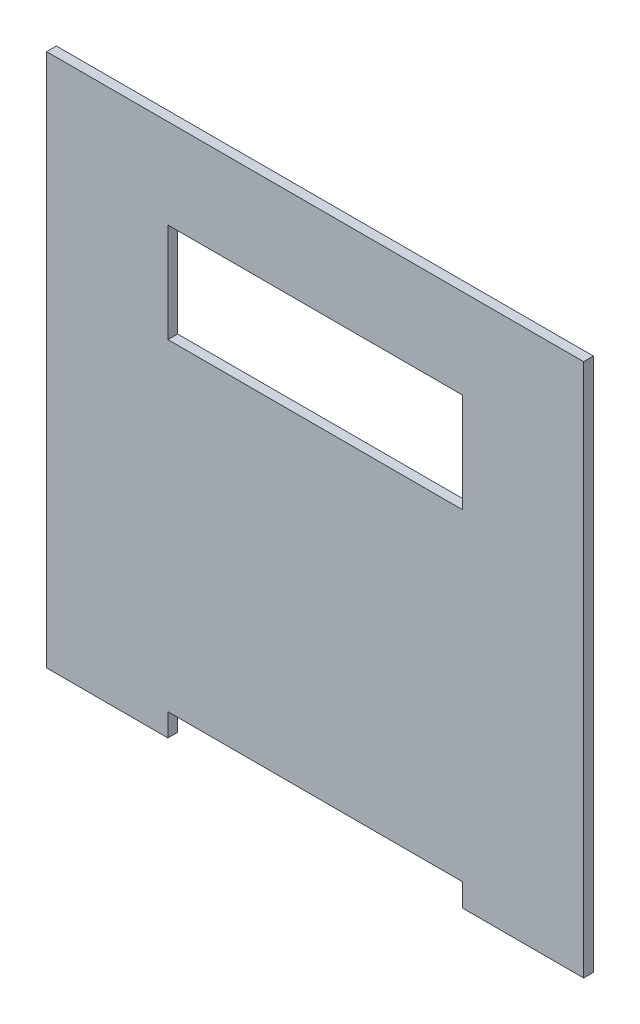
ISO-10303-21;
HEADER;
FILE_DESCRIPTION(('STEP AP214'),'2;1');
FILE_NAME('part.step','',(''),(''),'','','');
FILE_SCHEMA(('AUTOMOTIVE_DESIGN { 1 0 10303 214 1 1 1 1 }'));
ENDSEC;
DATA;
#1=APPLICATION_CONTEXT('core data for automotive mechanical design processes');
#2=APPLICATION_PROTOCOL_DEFINITION('international standard','automotive_design',2000,#1);
#3=PRODUCT_CONTEXT('',#1,'mechanical');
#4=PRODUCT('Part','Part','',(#3));
#5=PRODUCT_RELATED_PRODUCT_CATEGORY('part','',(#4));
#6=PRODUCT_DEFINITION_FORMATION('','',#4);
#7=PRODUCT_DEFINITION_CONTEXT('part definition',#1,'design');
#8=PRODUCT_DEFINITION('design','',#6,#7);
#9=PRODUCT_DEFINITION_SHAPE('','',#8);
#10=(LENGTH_UNIT() NAMED_UNIT(*) SI_UNIT(.MILLI.,.METRE.));
#11=(NAMED_UNIT(*) PLANE_ANGLE_UNIT() SI_UNIT($,.RADIAN.));
#12=(NAMED_UNIT(*) SI_UNIT($,.STERADIAN.) SOLID_ANGLE_UNIT());
#13=UNCERTAINTY_MEASURE_WITH_UNIT(LENGTH_MEASURE(1.E-05),#10,'distance_accuracy_value','');
#14=(GEOMETRIC_REPRESENTATION_CONTEXT(3) GLOBAL_UNCERTAINTY_ASSIGNED_CONTEXT((#13)) GLOBAL_UNIT_ASSIGNED_CONTEXT((#10,
#11,#12)) REPRESENTATION_CONTEXT('',''));
#15=CARTESIAN_POINT('',(0.,0.,0.));
#16=DIRECTION('',(0.,0.,1.));
#17=DIRECTION('',(1.,0.,0.));
#18=AXIS2_PLACEMENT_3D('',#15,#16,#17);
#19=CARTESIAN_POINT('',(0.,0.,6.));
#20=DIRECTION('',(0.,1.,0.));
#21=DIRECTION('',(-1.,0.,0.));
#22=AXIS2_PLACEMENT_3D('',#19,#20,#21);
#23=PLANE('',#22);
#24=DIRECTION('',(1.,0.,0.));
#25=VECTOR('',#24,1.);
#26=CARTESIAN_POINT('',(0.,0.,6.));
#27=LINE('',#26,#25);
#28=CARTESIAN_POINT('',(-74.5,0.,6.));
#29=VERTEX_POINT('',#28);
#30=CARTESIAN_POINT('',(0.,0.,6.));
#31=VERTEX_POINT('',#30);
#32=EDGE_CURVE('E139',#29,#31,#27,.T.);
#33=ORIENTED_EDGE('',*,*,#32,.F.);
#34=DIRECTION('',(0.,0.,-1.));
#35=VECTOR('',#34,1.);
#36=CARTESIAN_POINT('',(-74.5,0.,6.));
#37=LINE('',#36,#35);
#38=CARTESIAN_POINT('',(-74.5,0.,0.));
#39=VERTEX_POINT('',#38);
#40=EDGE_CURVE('E123',#29,#39,#37,.T.);
#41=ORIENTED_EDGE('',*,*,#40,.T.);
#42=DIRECTION('',(1.,0.,0.));
#43=VECTOR('',#42,1.);
#44=CARTESIAN_POINT('',(0.,0.,0.));
#45=LINE('',#44,#43);
#46=CARTESIAN_POINT('',(0.,0.,0.));
#47=VERTEX_POINT('',#46);
#48=EDGE_CURVE('E165',#39,#47,#45,.T.);
#49=ORIENTED_EDGE('',*,*,#48,.T.);
#50=DIRECTION('',(0.,0.,-1.));
#51=VECTOR('',#50,1.);
#52=CARTESIAN_POINT('',(0.,0.,6.));
#53=LINE('',#52,#51);
#54=EDGE_CURVE('E147',#31,#47,#53,.T.);
#55=ORIENTED_EDGE('',*,*,#54,.F.);
#56=EDGE_LOOP('',(#33,#41,#49,#55));
#57=FACE_BOUND('',#56,.T.);
#58=ADVANCED_FACE('F33',(#57),#23,.F.);
#59=CARTESIAN_POINT('',(0.,0.,6.));
#60=DIRECTION('',(-1.,0.,0.));
#61=DIRECTION('',(0.,-1.,0.));
#62=AXIS2_PLACEMENT_3D('',#59,#60,#61);
#63=PLANE('',#62);
#64=DIRECTION('',(0.,1.,0.));
#65=VECTOR('',#64,1.);
#66=CARTESIAN_POINT('',(0.,0.,0.));
#67=LINE('',#66,#65);
#68=CARTESIAN_POINT('',(0.,328.,0.));
#69=VERTEX_POINT('',#68);
#70=EDGE_CURVE('E157',#47,#69,#67,.T.);
#71=ORIENTED_EDGE('',*,*,#70,.T.);
#72=DIRECTION('',(0.,0.,-1.));
#73=VECTOR('',#72,1.);
#74=CARTESIAN_POINT('',(0.,328.,6.));
#75=LINE('',#74,#73);
#76=CARTESIAN_POINT('',(0.,328.,6.));
#77=VERTEX_POINT('',#76);
#78=EDGE_CURVE('E11',#77,#69,#75,.T.);
#79=ORIENTED_EDGE('',*,*,#78,.F.);
#80=DIRECTION('',(0.,1.,0.));
#81=VECTOR('',#80,1.);
#82=CARTESIAN_POINT('',(0.,0.,6.));
#83=LINE('',#82,#81);
#84=EDGE_CURVE('E169',#31,#77,#83,.T.);
#85=ORIENTED_EDGE('',*,*,#84,.F.);
#86=ORIENTED_EDGE('',*,*,#54,.T.);
#87=EDGE_LOOP('',(#71,#79,#85,#86));
#88=FACE_BOUND('',#87,.T.);
#89=ADVANCED_FACE('F35',(#88),#63,.F.);
#90=CARTESIAN_POINT('',(0.,328.,6.));
#91=DIRECTION('',(0.,-1.,0.));
#92=DIRECTION('',(1.,0.,0.));
#93=AXIS2_PLACEMENT_3D('',#90,#91,#92);
#94=PLANE('',#93);
#95=DIRECTION('',(-1.,0.,0.));
#96=VECTOR('',#95,1.);
#97=CARTESIAN_POINT('',(0.,328.,0.));
#98=LINE('',#97,#96);
#99=CARTESIAN_POINT('',(-330.,328.,0.));
#100=VERTEX_POINT('',#99);
#101=EDGE_CURVE('E160',#69,#100,#98,.T.);
#102=ORIENTED_EDGE('',*,*,#101,.T.);
#103=DIRECTION('',(0.,0.,-1.));
#104=VECTOR('',#103,1.);
#105=CARTESIAN_POINT('',(-330.,328.,6.));
#106=LINE('',#105,#104);
#107=CARTESIAN_POINT('',(-330.,328.,6.));
#108=VERTEX_POINT('',#107);
#109=EDGE_CURVE('E41',#108,#100,#106,.T.);
#110=ORIENTED_EDGE('',*,*,#109,.F.);
#111=DIRECTION('',(-1.,0.,0.));
#112=VECTOR('',#111,1.);
#113=CARTESIAN_POINT('',(0.,328.,6.));
#114=LINE('',#113,#112);
#115=EDGE_CURVE('E153',#77,#108,#114,.T.);
#116=ORIENTED_EDGE('',*,*,#115,.F.);
#117=ORIENTED_EDGE('',*,*,#78,.T.);
#118=EDGE_LOOP('',(#102,#110,#116,#117));
#119=FACE_BOUND('',#118,.T.);
#120=ADVANCED_FACE('F249',(#119),#94,.F.);
#121=CARTESIAN_POINT('',(-330.,0.,6.));
#122=DIRECTION('',(1.,0.,0.));
#123=DIRECTION('',(0.,0.,-1.));
#124=AXIS2_PLACEMENT_3D('',#121,#122,#123);
#125=PLANE('',#124);
#126=DIRECTION('',(0.,-1.,0.));
#127=VECTOR('',#126,1.);
#128=CARTESIAN_POINT('',(-330.,0.,0.));
#129=LINE('',#128,#127);
#130=CARTESIAN_POINT('',(-330.,0.,0.));
#131=VERTEX_POINT('',#130);
#132=EDGE_CURVE('E163',#100,#131,#129,.T.);
#133=ORIENTED_EDGE('',*,*,#132,.T.);
#134=DIRECTION('',(0.,0.,-1.));
#135=VECTOR('',#134,1.);
#136=CARTESIAN_POINT('',(-330.,0.,6.));
#137=LINE('',#136,#135);
#138=CARTESIAN_POINT('',(-330.,0.,6.));
#139=VERTEX_POINT('',#138);
#140=EDGE_CURVE('E171',#139,#131,#137,.T.);
#141=ORIENTED_EDGE('',*,*,#140,.F.);
#142=DIRECTION('',(0.,-1.,0.));
#143=VECTOR('',#142,1.);
#144=CARTESIAN_POINT('',(-330.,0.,6.));
#145=LINE('',#144,#143);
#146=EDGE_CURVE('E150',#108,#139,#145,.T.);
#147=ORIENTED_EDGE('',*,*,#146,.F.);
#148=ORIENTED_EDGE('',*,*,#109,.T.);
#149=EDGE_LOOP('',(#133,#141,#147,#148));
#150=FACE_BOUND('',#149,.T.);
#151=ADVANCED_FACE('F178',(#150),#125,.F.);
#152=CARTESIAN_POINT('',(-255.5,0.,0.));
#153=VERTEX_POINT('',#152);
#154=EDGE_CURVE('E166',#131,#153,#45,.T.);
#155=ORIENTED_EDGE('',*,*,#154,.T.);
#156=DIRECTION('',(0.,0.,-1.));
#157=VECTOR('',#156,1.);
#158=CARTESIAN_POINT('',(-255.5,0.,6.));
#159=LINE('',#158,#157);
#160=CARTESIAN_POINT('',(-255.5,0.,6.));
#161=VERTEX_POINT('',#160);
#162=EDGE_CURVE('E48',#161,#153,#159,.T.);
#163=ORIENTED_EDGE('',*,*,#162,.F.);
#164=EDGE_CURVE('E149',#139,#161,#27,.T.);
#165=ORIENTED_EDGE('',*,*,#164,.F.);
#166=ORIENTED_EDGE('',*,*,#140,.T.);
#167=EDGE_LOOP('',(#155,#163,#165,#166));
#168=FACE_BOUND('',#167,.T.);
#169=ADVANCED_FACE('F188',(#168),#23,.F.);
#170=CARTESIAN_POINT('',(0.,0.,6.));
#171=DIRECTION('',(0.,0.,1.));
#172=DIRECTION('',(1.,0.,0.));
#173=AXIS2_PLACEMENT_3D('',#170,#171,#172);
#174=PLANE('',#173);
#175=DIRECTION('',(0.,-1.,0.));
#176=VECTOR('',#175,1.);
#177=CARTESIAN_POINT('',(-74.5,0.,6.));
#178=LINE('',#177,#176);
#179=CARTESIAN_POINT('',(-74.5,14.,6.));
#180=VERTEX_POINT('',#179);
#181=EDGE_CURVE('E126',#180,#29,#178,.T.);
#182=ORIENTED_EDGE('',*,*,#181,.T.);
#183=ORIENTED_EDGE('',*,*,#32,.T.);
#184=ORIENTED_EDGE('',*,*,#84,.T.);
#185=ORIENTED_EDGE('',*,*,#115,.T.);
#186=ORIENTED_EDGE('',*,*,#146,.T.);
#187=ORIENTED_EDGE('',*,*,#164,.T.);
#188=DIRECTION('',(0.,1.,0.));
#189=VECTOR('',#188,1.);
#190=CARTESIAN_POINT('',(-255.5,0.,6.));
#191=LINE('',#190,#189);
#192=CARTESIAN_POINT('',(-255.5,14.,6.));
#193=VERTEX_POINT('',#192);
#194=EDGE_CURVE('E143',#161,#193,#191,.T.);
#195=ORIENTED_EDGE('',*,*,#194,.T.);
#196=DIRECTION('',(1.,0.,0.));
#197=VECTOR('',#196,1.);
#198=CARTESIAN_POINT('',(-74.5,14.,6.));
#199=LINE('',#198,#197);
#200=EDGE_CURVE('E133',#193,#180,#199,.T.);
#201=ORIENTED_EDGE('',*,*,#200,.T.);
#202=EDGE_LOOP('',(#182,#183,#184,#185,#186,#187,#195,#201));
#203=FACE_BOUND('',#202,.T.);
#204=DIRECTION('',(0.,-1.,0.));
#205=VECTOR('',#204,1.);
#206=CARTESIAN_POINT('',(-74.5,273.,6.));
#207=LINE('',#206,#205);
#208=CARTESIAN_POINT('',(-74.5,273.,6.));
#209=VERTEX_POINT('',#208);
#210=CARTESIAN_POINT('',(-74.5,212.,6.));
#211=VERTEX_POINT('',#210);
#212=EDGE_CURVE('E205',#209,#211,#207,.T.);
#213=ORIENTED_EDGE('',*,*,#212,.T.);
#214=DIRECTION('',(-1.,0.,0.));
#215=VECTOR('',#214,1.);
#216=CARTESIAN_POINT('',(-74.5,212.,6.));
#217=LINE('',#216,#215);
#218=CARTESIAN_POINT('',(-255.5,212.,6.));
#219=VERTEX_POINT('',#218);
#220=EDGE_CURVE('E218',#211,#219,#217,.T.);
#221=ORIENTED_EDGE('',*,*,#220,.T.);
#222=DIRECTION('',(0.,1.,0.));
#223=VECTOR('',#222,1.);
#224=CARTESIAN_POINT('',(-255.5,273.,6.));
#225=LINE('',#224,#223);
#226=CARTESIAN_POINT('',(-255.5,273.,6.));
#227=VERTEX_POINT('',#226);
#228=EDGE_CURVE('E56',#219,#227,#225,.T.);
#229=ORIENTED_EDGE('',*,*,#228,.T.);
#230=DIRECTION('',(1.,0.,0.));
#231=VECTOR('',#230,1.);
#232=CARTESIAN_POINT('',(-74.5,273.,6.));
#233=LINE('',#232,#231);
#234=EDGE_CURVE('E197',#227,#209,#233,.T.);
#235=ORIENTED_EDGE('',*,*,#234,.T.);
#236=EDGE_LOOP('',(#213,#221,#229,#235));
#237=FACE_BOUND('',#236,.T.);
#238=ADVANCED_FACE('F136',(#203,#237),#174,.T.);
#239=CARTESIAN_POINT('',(0.,0.,0.));
#240=DIRECTION('',(0.,0.,1.));
#241=DIRECTION('',(1.,0.,0.));
#242=AXIS2_PLACEMENT_3D('',#239,#240,#241);
#243=PLANE('',#242);
#244=DIRECTION('',(-1.,0.,0.));
#245=VECTOR('',#244,1.);
#246=CARTESIAN_POINT('',(-74.5,212.,0.));
#247=LINE('',#246,#245);
#248=CARTESIAN_POINT('',(-74.5,212.,0.));
#249=VERTEX_POINT('',#248);
#250=CARTESIAN_POINT('',(-255.5,212.,0.));
#251=VERTEX_POINT('',#250);
#252=EDGE_CURVE('E209',#249,#251,#247,.T.);
#253=ORIENTED_EDGE('',*,*,#252,.F.);
#254=DIRECTION('',(0.,-1.,0.));
#255=VECTOR('',#254,1.);
#256=CARTESIAN_POINT('',(-74.5,273.,0.));
#257=LINE('',#256,#255);
#258=CARTESIAN_POINT('',(-74.5,273.,0.));
#259=VERTEX_POINT('',#258);
#260=EDGE_CURVE('E212',#259,#249,#257,.T.);
#261=ORIENTED_EDGE('',*,*,#260,.F.);
#262=DIRECTION('',(1.,0.,0.));
#263=VECTOR('',#262,1.);
#264=CARTESIAN_POINT('',(-74.5,273.,0.));
#265=LINE('',#264,#263);
#266=CARTESIAN_POINT('',(-255.5,273.,0.));
#267=VERTEX_POINT('',#266);
#268=EDGE_CURVE('E202',#267,#259,#265,.T.);
#269=ORIENTED_EDGE('',*,*,#268,.F.);
#270=DIRECTION('',(0.,1.,0.));
#271=VECTOR('',#270,1.);
#272=CARTESIAN_POINT('',(-255.5,273.,0.));
#273=LINE('',#272,#271);
#274=EDGE_CURVE('E206',#251,#267,#273,.T.);
#275=ORIENTED_EDGE('',*,*,#274,.F.);
#276=EDGE_LOOP('',(#253,#261,#269,#275));
#277=FACE_BOUND('',#276,.T.);
#278=ORIENTED_EDGE('',*,*,#48,.F.);
#279=DIRECTION('',(0.,-1.,0.));
#280=VECTOR('',#279,1.);
#281=CARTESIAN_POINT('',(-74.5,0.,0.));
#282=LINE('',#281,#280);
#283=CARTESIAN_POINT('',(-74.5,14.,0.));
#284=VERTEX_POINT('',#283);
#285=EDGE_CURVE('E129',#284,#39,#282,.T.);
#286=ORIENTED_EDGE('',*,*,#285,.F.);
#287=DIRECTION('',(1.,0.,0.));
#288=VECTOR('',#287,1.);
#289=CARTESIAN_POINT('',(-74.5,14.,0.));
#290=LINE('',#289,#288);
#291=CARTESIAN_POINT('',(-255.5,14.,0.));
#292=VERTEX_POINT('',#291);
#293=EDGE_CURVE('E144',#292,#284,#290,.T.);
#294=ORIENTED_EDGE('',*,*,#293,.F.);
#295=DIRECTION('',(0.,1.,0.));
#296=VECTOR('',#295,1.);
#297=CARTESIAN_POINT('',(-255.5,0.,0.));
#298=LINE('',#297,#296);
#299=EDGE_CURVE('E186',#153,#292,#298,.T.);
#300=ORIENTED_EDGE('',*,*,#299,.F.);
#301=ORIENTED_EDGE('',*,*,#154,.F.);
#302=ORIENTED_EDGE('',*,*,#132,.F.);
#303=ORIENTED_EDGE('',*,*,#101,.F.);
#304=ORIENTED_EDGE('',*,*,#70,.F.);
#305=EDGE_LOOP('',(#278,#286,#294,#300,#301,#302,#303,#304));
#306=FACE_BOUND('',#305,.T.);
#307=ADVANCED_FACE('F183',(#277,#306),#243,.F.);
#308=CARTESIAN_POINT('',(-74.5,273.,6.));
#309=DIRECTION('',(1.,0.,0.));
#310=DIRECTION('',(0.,0.,-1.));
#311=AXIS2_PLACEMENT_3D('',#308,#309,#310);
#312=PLANE('',#311);
#313=ORIENTED_EDGE('',*,*,#260,.T.);
#314=DIRECTION('',(0.,0.,-1.));
#315=VECTOR('',#314,1.);
#316=CARTESIAN_POINT('',(-74.5,212.,6.));
#317=LINE('',#316,#315);
#318=EDGE_CURVE('E193',#211,#249,#317,.T.);
#319=ORIENTED_EDGE('',*,*,#318,.F.);
#320=ORIENTED_EDGE('',*,*,#212,.F.);
#321=DIRECTION('',(0.,0.,-1.));
#322=VECTOR('',#321,1.);
#323=CARTESIAN_POINT('',(-74.5,273.,6.));
#324=LINE('',#323,#322);
#325=EDGE_CURVE('E161',#209,#259,#324,.T.);
#326=ORIENTED_EDGE('',*,*,#325,.T.);
#327=EDGE_LOOP('',(#313,#319,#320,#326));
#328=FACE_BOUND('',#327,.T.);
#329=ADVANCED_FACE('F293',(#328),#312,.F.);
#330=CARTESIAN_POINT('',(-74.5,273.,6.));
#331=DIRECTION('',(0.,1.,0.));
#332=DIRECTION('',(0.,0.,1.));
#333=AXIS2_PLACEMENT_3D('',#330,#331,#332);
#334=PLANE('',#333);
#335=ORIENTED_EDGE('',*,*,#268,.T.);
#336=ORIENTED_EDGE('',*,*,#325,.F.);
#337=ORIENTED_EDGE('',*,*,#234,.F.);
#338=DIRECTION('',(0.,0.,-1.));
#339=VECTOR('',#338,1.);
#340=CARTESIAN_POINT('',(-255.5,273.,6.));
#341=LINE('',#340,#339);
#342=EDGE_CURVE('E199',#227,#267,#341,.T.);
#343=ORIENTED_EDGE('',*,*,#342,.T.);
#344=EDGE_LOOP('',(#335,#336,#337,#343));
#345=FACE_BOUND('',#344,.T.);
#346=ADVANCED_FACE('F305',(#345),#334,.F.);
#347=CARTESIAN_POINT('',(-255.5,273.,6.));
#348=DIRECTION('',(-1.,0.,0.));
#349=DIRECTION('',(0.,0.,1.));
#350=AXIS2_PLACEMENT_3D('',#347,#348,#349);
#351=PLANE('',#350);
#352=ORIENTED_EDGE('',*,*,#274,.T.);
#353=ORIENTED_EDGE('',*,*,#342,.F.);
#354=ORIENTED_EDGE('',*,*,#228,.F.);
#355=DIRECTION('',(0.,0.,-1.));
#356=VECTOR('',#355,1.);
#357=CARTESIAN_POINT('',(-255.5,212.,6.));
#358=LINE('',#357,#356);
#359=EDGE_CURVE('E196',#219,#251,#358,.T.);
#360=ORIENTED_EDGE('',*,*,#359,.T.);
#361=EDGE_LOOP('',(#352,#353,#354,#360));
#362=FACE_BOUND('',#361,.T.);
#363=ADVANCED_FACE('F314',(#362),#351,.F.);
#364=CARTESIAN_POINT('',(-74.5,212.,6.));
#365=DIRECTION('',(0.,-1.,0.));
#366=DIRECTION('',(0.,0.,-1.));
#367=AXIS2_PLACEMENT_3D('',#364,#365,#366);
#368=PLANE('',#367);
#369=ORIENTED_EDGE('',*,*,#252,.T.);
#370=ORIENTED_EDGE('',*,*,#359,.F.);
#371=ORIENTED_EDGE('',*,*,#220,.F.);
#372=ORIENTED_EDGE('',*,*,#318,.T.);
#373=EDGE_LOOP('',(#369,#370,#371,#372));
#374=FACE_BOUND('',#373,.T.);
#375=ADVANCED_FACE('F242',(#374),#368,.F.);
#376=CARTESIAN_POINT('',(-74.5,0.,6.));
#377=DIRECTION('',(1.,0.,0.));
#378=DIRECTION('',(0.,0.,-1.));
#379=AXIS2_PLACEMENT_3D('',#376,#377,#378);
#380=PLANE('',#379);
#381=ORIENTED_EDGE('',*,*,#285,.T.);
#382=ORIENTED_EDGE('',*,*,#40,.F.);
#383=ORIENTED_EDGE('',*,*,#181,.F.);
#384=DIRECTION('',(0.,0.,-1.));
#385=VECTOR('',#384,1.);
#386=CARTESIAN_POINT('',(-74.5,14.,6.));
#387=LINE('',#386,#385);
#388=EDGE_CURVE('E214',#180,#284,#387,.T.);
#389=ORIENTED_EDGE('',*,*,#388,.T.);
#390=EDGE_LOOP('',(#381,#382,#383,#389));
#391=FACE_BOUND('',#390,.T.);
#392=ADVANCED_FACE('F125',(#391),#380,.F.);
#393=CARTESIAN_POINT('',(-74.5,14.,6.));
#394=DIRECTION('',(0.,1.,0.));
#395=DIRECTION('',(0.,0.,1.));
#396=AXIS2_PLACEMENT_3D('',#393,#394,#395);
#397=PLANE('',#396);
#398=ORIENTED_EDGE('',*,*,#293,.T.);
#399=ORIENTED_EDGE('',*,*,#388,.F.);
#400=ORIENTED_EDGE('',*,*,#200,.F.);
#401=DIRECTION('',(0.,0.,-1.));
#402=VECTOR('',#401,1.);
#403=CARTESIAN_POINT('',(-255.5,14.,6.));
#404=LINE('',#403,#402);
#405=EDGE_CURVE('E224',#193,#292,#404,.T.);
#406=ORIENTED_EDGE('',*,*,#405,.T.);
#407=EDGE_LOOP('',(#398,#399,#400,#406));
#408=FACE_BOUND('',#407,.T.);
#409=ADVANCED_FACE('F234',(#408),#397,.F.);
#410=CARTESIAN_POINT('',(-255.5,0.,6.));
#411=DIRECTION('',(-1.,0.,0.));
#412=DIRECTION('',(0.,0.,1.));
#413=AXIS2_PLACEMENT_3D('',#410,#411,#412);
#414=PLANE('',#413);
#415=ORIENTED_EDGE('',*,*,#299,.T.);
#416=ORIENTED_EDGE('',*,*,#405,.F.);
#417=ORIENTED_EDGE('',*,*,#194,.F.);
#418=ORIENTED_EDGE('',*,*,#162,.T.);
#419=EDGE_LOOP('',(#415,#416,#417,#418));
#420=FACE_BOUND('',#419,.T.);
#421=ADVANCED_FACE('F232',(#420),#414,.F.);
#422=CLOSED_SHELL('',(#58,#89,#120,#151,#169,#238,#307,#329,#346,#363,#375,#392,#409,#421));
#423=MANIFOLD_SOLID_BREP('B2',#422);
#424=ADVANCED_BREP_SHAPE_REPRESENTATION('',(#18,#423),#14);
#425=SHAPE_DEFINITION_REPRESENTATION(#9,#424);
ENDSEC;
END-ISO-10303-21;
